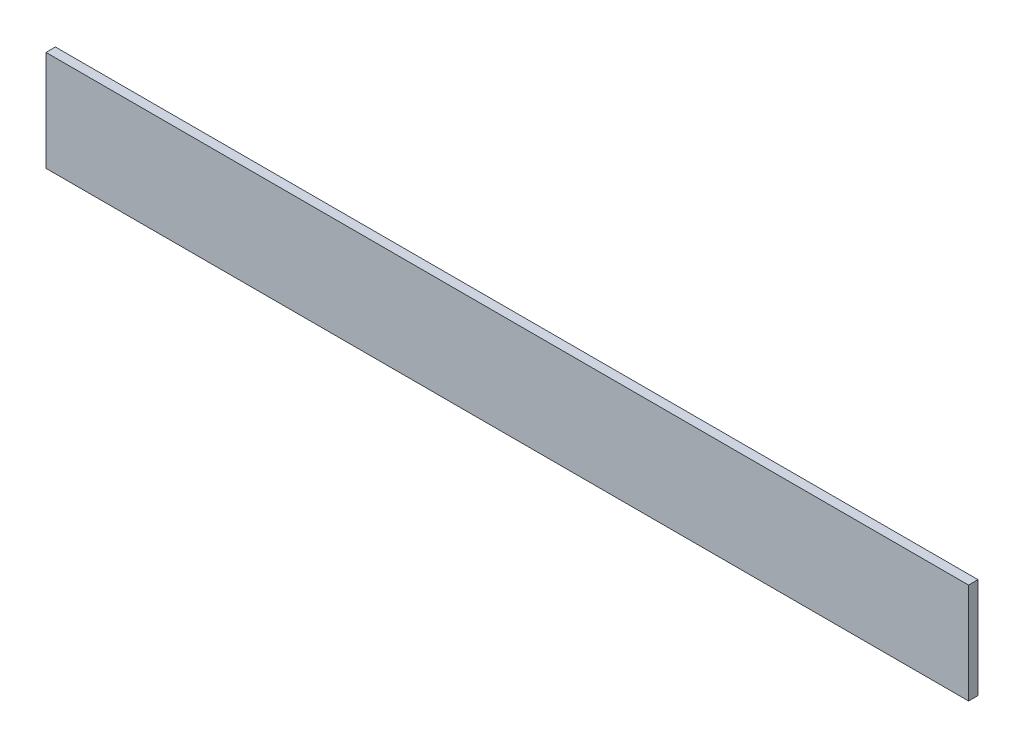
ISO-10303-21;
HEADER;
FILE_DESCRIPTION(('STEP AP214'),'2;1');
FILE_NAME('part.step','',(''),(''),'','','');
FILE_SCHEMA(('AUTOMOTIVE_DESIGN { 1 0 10303 214 1 1 1 1 }'));
ENDSEC;
DATA;
#1=APPLICATION_CONTEXT('core data for automotive mechanical design processes');
#2=APPLICATION_PROTOCOL_DEFINITION('international standard','automotive_design',2000,#1);
#3=PRODUCT_CONTEXT('',#1,'mechanical');
#4=PRODUCT('Part','Part','',(#3));
#5=PRODUCT_RELATED_PRODUCT_CATEGORY('part','',(#4));
#6=PRODUCT_DEFINITION_FORMATION('','',#4);
#7=PRODUCT_DEFINITION_CONTEXT('part definition',#1,'design');
#8=PRODUCT_DEFINITION('design','',#6,#7);
#9=PRODUCT_DEFINITION_SHAPE('','',#8);
#10=(LENGTH_UNIT() NAMED_UNIT(*) SI_UNIT(.MILLI.,.METRE.));
#11=(NAMED_UNIT(*) PLANE_ANGLE_UNIT() SI_UNIT($,.RADIAN.));
#12=(NAMED_UNIT(*) SI_UNIT($,.STERADIAN.) SOLID_ANGLE_UNIT());
#13=UNCERTAINTY_MEASURE_WITH_UNIT(LENGTH_MEASURE(1.E-05),#10,'distance_accuracy_value','');
#14=(GEOMETRIC_REPRESENTATION_CONTEXT(3) GLOBAL_UNCERTAINTY_ASSIGNED_CONTEXT((#13)) GLOBAL_UNIT_ASSIGNED_CONTEXT((#10,
#11,#12)) REPRESENTATION_CONTEXT('',''));
#15=CARTESIAN_POINT('',(0.,0.,0.));
#16=DIRECTION('',(0.,0.,1.));
#17=DIRECTION('',(1.,0.,0.));
#18=AXIS2_PLACEMENT_3D('',#15,#16,#17);
#19=CARTESIAN_POINT('',(147.,16.,1.5));
#20=DIRECTION('',(-1.,0.,0.));
#21=DIRECTION('',(0.,0.,1.));
#22=AXIS2_PLACEMENT_3D('',#19,#20,#21);
#23=PLANE('',#22);
#24=DIRECTION('',(0.,1.,0.));
#25=VECTOR('',#24,1.);
#26=CARTESIAN_POINT('',(147.,16.,-1.5));
#27=LINE('',#26,#25);
#28=CARTESIAN_POINT('',(147.,-16.,-1.5));
#29=VERTEX_POINT('',#28);
#30=CARTESIAN_POINT('',(147.,16.,-1.5));
#31=VERTEX_POINT('',#30);
#32=EDGE_CURVE('E100',#29,#31,#27,.T.);
#33=ORIENTED_EDGE('',*,*,#32,.T.);
#34=DIRECTION('',(0.,0.,-1.));
#35=VECTOR('',#34,1.);
#36=CARTESIAN_POINT('',(147.,16.,1.5));
#37=LINE('',#36,#35);
#38=CARTESIAN_POINT('',(147.,16.,1.5));
#39=VERTEX_POINT('',#38);
#40=EDGE_CURVE('E11',#39,#31,#37,.T.);
#41=ORIENTED_EDGE('',*,*,#40,.F.);
#42=DIRECTION('',(0.,1.,0.));
#43=VECTOR('',#42,1.);
#44=CARTESIAN_POINT('',(147.,16.,1.5));
#45=LINE('',#44,#43);
#46=CARTESIAN_POINT('',(147.,-16.,1.5));
#47=VERTEX_POINT('',#46);
#48=EDGE_CURVE('E88',#47,#39,#45,.T.);
#49=ORIENTED_EDGE('',*,*,#48,.F.);
#50=DIRECTION('',(0.,0.,-1.));
#51=VECTOR('',#50,1.);
#52=CARTESIAN_POINT('',(147.,-16.,1.5));
#53=LINE('',#52,#51);
#54=EDGE_CURVE('E96',#47,#29,#53,.T.);
#55=ORIENTED_EDGE('',*,*,#54,.T.);
#56=EDGE_LOOP('',(#33,#41,#49,#55));
#57=FACE_BOUND('',#56,.T.);
#58=ADVANCED_FACE('F37',(#57),#23,.F.);
#59=CARTESIAN_POINT('',(-147.,16.,1.5));
#60=DIRECTION('',(0.,-1.,0.));
#61=DIRECTION('',(0.,0.,-1.));
#62=AXIS2_PLACEMENT_3D('',#59,#60,#61);
#63=PLANE('',#62);
#64=DIRECTION('',(-1.,0.,0.));
#65=VECTOR('',#64,1.);
#66=CARTESIAN_POINT('',(-147.,16.,-1.5));
#67=LINE('',#66,#65);
#68=CARTESIAN_POINT('',(-147.,16.,-1.5));
#69=VERTEX_POINT('',#68);
#70=EDGE_CURVE('E92',#31,#69,#67,.T.);
#71=ORIENTED_EDGE('',*,*,#70,.T.);
#72=DIRECTION('',(0.,0.,-1.));
#73=VECTOR('',#72,1.);
#74=CARTESIAN_POINT('',(-147.,16.,1.5));
#75=LINE('',#74,#73);
#76=CARTESIAN_POINT('',(-147.,16.,1.5));
#77=VERTEX_POINT('',#76);
#78=EDGE_CURVE('E45',#77,#69,#75,.T.);
#79=ORIENTED_EDGE('',*,*,#78,.F.);
#80=DIRECTION('',(-1.,0.,0.));
#81=VECTOR('',#80,1.);
#82=CARTESIAN_POINT('',(-147.,16.,1.5));
#83=LINE('',#82,#81);
#84=EDGE_CURVE('E83',#39,#77,#83,.T.);
#85=ORIENTED_EDGE('',*,*,#84,.F.);
#86=ORIENTED_EDGE('',*,*,#40,.T.);
#87=EDGE_LOOP('',(#71,#79,#85,#86));
#88=FACE_BOUND('',#87,.T.);
#89=ADVANCED_FACE('F91',(#88),#63,.F.);
#90=CARTESIAN_POINT('',(-147.,16.,1.5));
#91=DIRECTION('',(1.,0.,0.));
#92=DIRECTION('',(0.,0.,-1.));
#93=AXIS2_PLACEMENT_3D('',#90,#91,#92);
#94=PLANE('',#93);
#95=DIRECTION('',(0.,-1.,0.));
#96=VECTOR('',#95,1.);
#97=CARTESIAN_POINT('',(-147.,16.,-1.5));
#98=LINE('',#97,#96);
#99=CARTESIAN_POINT('',(-147.,-16.,-1.5));
#100=VERTEX_POINT('',#99);
#101=EDGE_CURVE('E70',#69,#100,#98,.T.);
#102=ORIENTED_EDGE('',*,*,#101,.T.);
#103=DIRECTION('',(0.,0.,-1.));
#104=VECTOR('',#103,1.);
#105=CARTESIAN_POINT('',(-147.,-16.,1.5));
#106=LINE('',#105,#104);
#107=CARTESIAN_POINT('',(-147.,-16.,1.5));
#108=VERTEX_POINT('',#107);
#109=EDGE_CURVE('E93',#108,#100,#106,.T.);
#110=ORIENTED_EDGE('',*,*,#109,.F.);
#111=DIRECTION('',(0.,-1.,0.));
#112=VECTOR('',#111,1.);
#113=CARTESIAN_POINT('',(-147.,16.,1.5));
#114=LINE('',#113,#112);
#115=EDGE_CURVE('E86',#77,#108,#114,.T.);
#116=ORIENTED_EDGE('',*,*,#115,.F.);
#117=ORIENTED_EDGE('',*,*,#78,.T.);
#118=EDGE_LOOP('',(#102,#110,#116,#117));
#119=FACE_BOUND('',#118,.T.);
#120=ADVANCED_FACE('F94',(#119),#94,.F.);
#121=CARTESIAN_POINT('',(-147.,-16.,1.5));
#122=DIRECTION('',(0.,1.,0.));
#123=DIRECTION('',(0.,0.,1.));
#124=AXIS2_PLACEMENT_3D('',#121,#122,#123);
#125=PLANE('',#124);
#126=DIRECTION('',(1.,0.,0.));
#127=VECTOR('',#126,1.);
#128=CARTESIAN_POINT('',(-147.,-16.,-1.5));
#129=LINE('',#128,#127);
#130=EDGE_CURVE('E76',#100,#29,#129,.T.);
#131=ORIENTED_EDGE('',*,*,#130,.T.);
#132=ORIENTED_EDGE('',*,*,#54,.F.);
#133=DIRECTION('',(1.,0.,0.));
#134=VECTOR('',#133,1.);
#135=CARTESIAN_POINT('',(-147.,-16.,1.5));
#136=LINE('',#135,#134);
#137=EDGE_CURVE('E53',#108,#47,#136,.T.);
#138=ORIENTED_EDGE('',*,*,#137,.F.);
#139=ORIENTED_EDGE('',*,*,#109,.T.);
#140=EDGE_LOOP('',(#131,#132,#138,#139));
#141=FACE_BOUND('',#140,.T.);
#142=ADVANCED_FACE('F107',(#141),#125,.F.);
#143=CARTESIAN_POINT('',(0.,0.,1.5));
#144=DIRECTION('',(0.,0.,1.));
#145=DIRECTION('',(1.,0.,0.));
#146=AXIS2_PLACEMENT_3D('',#143,#144,#145);
#147=PLANE('',#146);
#148=ORIENTED_EDGE('',*,*,#48,.T.);
#149=ORIENTED_EDGE('',*,*,#84,.T.);
#150=ORIENTED_EDGE('',*,*,#115,.T.);
#151=ORIENTED_EDGE('',*,*,#137,.T.);
#152=EDGE_LOOP('',(#148,#149,#150,#151));
#153=FACE_BOUND('',#152,.T.);
#154=ADVANCED_FACE('F84',(#153),#147,.T.);
#155=CARTESIAN_POINT('',(0.,0.,-1.5));
#156=DIRECTION('',(0.,0.,1.));
#157=DIRECTION('',(1.,0.,0.));
#158=AXIS2_PLACEMENT_3D('',#155,#156,#157);
#159=PLANE('',#158);
#160=ORIENTED_EDGE('',*,*,#32,.F.);
#161=ORIENTED_EDGE('',*,*,#130,.F.);
#162=ORIENTED_EDGE('',*,*,#101,.F.);
#163=ORIENTED_EDGE('',*,*,#70,.F.);
#164=EDGE_LOOP('',(#160,#161,#162,#163));
#165=FACE_BOUND('',#164,.T.);
#166=ADVANCED_FACE('F110',(#165),#159,.F.);
#167=CLOSED_SHELL('',(#58,#89,#120,#142,#154,#166));
#168=MANIFOLD_SOLID_BREP('B2',#167);
#169=ADVANCED_BREP_SHAPE_REPRESENTATION('',(#18,#168),#14);
#170=SHAPE_DEFINITION_REPRESENTATION(#9,#169);
ENDSEC;
END-ISO-10303-21;
